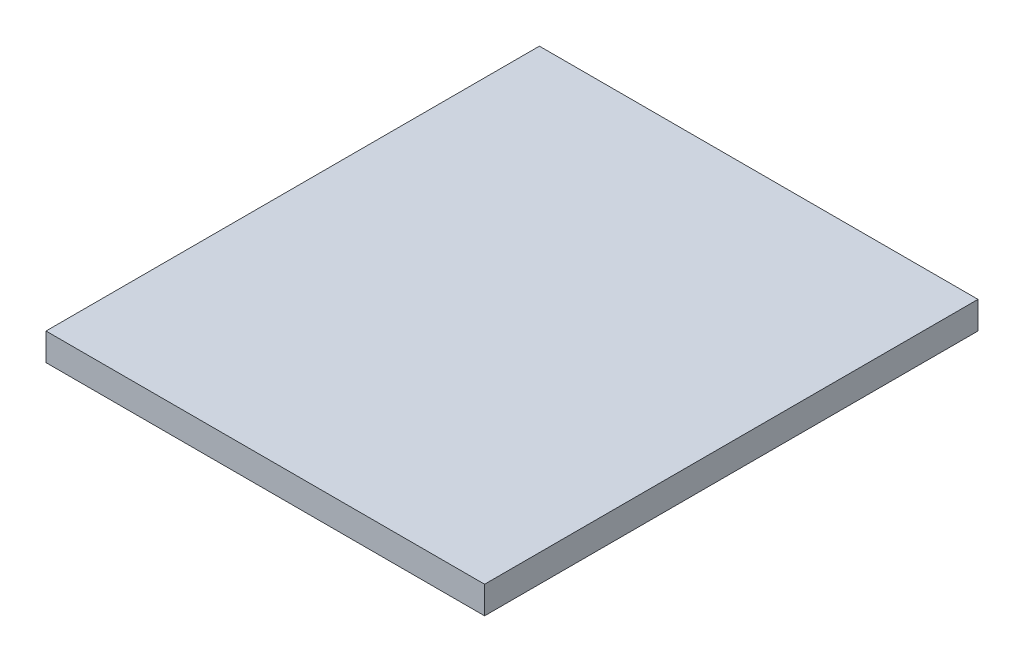
ISO-10303-21;
HEADER;
FILE_DESCRIPTION(('STEP AP214'),'2;1');
FILE_NAME('part.step','',(''),(''),'','','');
FILE_SCHEMA(('AUTOMOTIVE_DESIGN { 1 0 10303 214 1 1 1 1 }'));
ENDSEC;
DATA;
#1=APPLICATION_CONTEXT('core data for automotive mechanical design processes');
#2=APPLICATION_PROTOCOL_DEFINITION('international standard','automotive_design',2000,#1);
#3=PRODUCT_CONTEXT('',#1,'mechanical');
#4=PRODUCT('Part','Part','',(#3));
#5=PRODUCT_RELATED_PRODUCT_CATEGORY('part','',(#4));
#6=PRODUCT_DEFINITION_FORMATION('','',#4);
#7=PRODUCT_DEFINITION_CONTEXT('part definition',#1,'design');
#8=PRODUCT_DEFINITION('design','',#6,#7);
#9=PRODUCT_DEFINITION_SHAPE('','',#8);
#10=(LENGTH_UNIT() NAMED_UNIT(*) SI_UNIT(.MILLI.,.METRE.));
#11=(NAMED_UNIT(*) PLANE_ANGLE_UNIT() SI_UNIT($,.RADIAN.));
#12=(NAMED_UNIT(*) SI_UNIT($,.STERADIAN.) SOLID_ANGLE_UNIT());
#13=UNCERTAINTY_MEASURE_WITH_UNIT(LENGTH_MEASURE(1.E-05),#10,'distance_accuracy_value','');
#14=(GEOMETRIC_REPRESENTATION_CONTEXT(3) GLOBAL_UNCERTAINTY_ASSIGNED_CONTEXT((#13)) GLOBAL_UNIT_ASSIGNED_CONTEXT((#10,
#11,#12)) REPRESENTATION_CONTEXT('',''));
#15=CARTESIAN_POINT('',(0.,0.,0.));
#16=DIRECTION('',(0.,0.,1.));
#17=DIRECTION('',(1.,0.,0.));
#18=AXIS2_PLACEMENT_3D('',#15,#16,#17);
#19=CARTESIAN_POINT('',(-4.,0.5,4.5));
#20=DIRECTION('',(1.,0.,0.));
#21=DIRECTION('',(0.,0.,-1.));
#22=AXIS2_PLACEMENT_3D('',#19,#20,#21);
#23=PLANE('',#22);
#24=DIRECTION('',(0.,0.,1.));
#25=VECTOR('',#24,1.);
#26=CARTESIAN_POINT('',(-4.,0.,4.5));
#27=LINE('',#26,#25);
#28=CARTESIAN_POINT('',(-4.,0.,-4.5));
#29=VERTEX_POINT('',#28);
#30=CARTESIAN_POINT('',(-4.,0.,4.5));
#31=VERTEX_POINT('',#30);
#32=EDGE_CURVE('E96',#29,#31,#27,.T.);
#33=ORIENTED_EDGE('',*,*,#32,.T.);
#34=DIRECTION('',(0.,-1.,0.));
#35=VECTOR('',#34,1.);
#36=CARTESIAN_POINT('',(-4.,0.5,4.5));
#37=LINE('',#36,#35);
#38=CARTESIAN_POINT('',(-4.,0.5,4.5));
#39=VERTEX_POINT('',#38);
#40=EDGE_CURVE('E11',#39,#31,#37,.T.);
#41=ORIENTED_EDGE('',*,*,#40,.F.);
#42=DIRECTION('',(0.,0.,1.));
#43=VECTOR('',#42,1.);
#44=CARTESIAN_POINT('',(-4.,0.5,4.5));
#45=LINE('',#44,#43);
#46=CARTESIAN_POINT('',(-4.,0.5,-4.5));
#47=VERTEX_POINT('',#46);
#48=EDGE_CURVE('E84',#47,#39,#45,.T.);
#49=ORIENTED_EDGE('',*,*,#48,.F.);
#50=DIRECTION('',(0.,-1.,0.));
#51=VECTOR('',#50,1.);
#52=CARTESIAN_POINT('',(-4.,0.5,-4.5));
#53=LINE('',#52,#51);
#54=EDGE_CURVE('E92',#47,#29,#53,.T.);
#55=ORIENTED_EDGE('',*,*,#54,.T.);
#56=EDGE_LOOP('',(#33,#41,#49,#55));
#57=FACE_BOUND('',#56,.T.);
#58=ADVANCED_FACE('F33',(#57),#23,.F.);
#59=CARTESIAN_POINT('',(4.,0.5,4.5));
#60=DIRECTION('',(0.,0.,-1.));
#61=DIRECTION('',(-1.,0.,0.));
#62=AXIS2_PLACEMENT_3D('',#59,#60,#61);
#63=PLANE('',#62);
#64=DIRECTION('',(1.,0.,0.));
#65=VECTOR('',#64,1.);
#66=CARTESIAN_POINT('',(4.,0.,4.5));
#67=LINE('',#66,#65);
#68=CARTESIAN_POINT('',(4.,0.,4.5));
#69=VERTEX_POINT('',#68);
#70=EDGE_CURVE('E88',#31,#69,#67,.T.);
#71=ORIENTED_EDGE('',*,*,#70,.T.);
#72=DIRECTION('',(0.,-1.,0.));
#73=VECTOR('',#72,1.);
#74=CARTESIAN_POINT('',(4.,0.5,4.5));
#75=LINE('',#74,#73);
#76=CARTESIAN_POINT('',(4.,0.5,4.5));
#77=VERTEX_POINT('',#76);
#78=EDGE_CURVE('E41',#77,#69,#75,.T.);
#79=ORIENTED_EDGE('',*,*,#78,.F.);
#80=DIRECTION('',(1.,0.,0.));
#81=VECTOR('',#80,1.);
#82=CARTESIAN_POINT('',(4.,0.5,4.5));
#83=LINE('',#82,#81);
#84=EDGE_CURVE('E79',#39,#77,#83,.T.);
#85=ORIENTED_EDGE('',*,*,#84,.F.);
#86=ORIENTED_EDGE('',*,*,#40,.T.);
#87=EDGE_LOOP('',(#71,#79,#85,#86));
#88=FACE_BOUND('',#87,.T.);
#89=ADVANCED_FACE('F87',(#88),#63,.F.);
#90=CARTESIAN_POINT('',(4.,0.5,4.5));
#91=DIRECTION('',(-1.,0.,0.));
#92=DIRECTION('',(0.,0.,1.));
#93=AXIS2_PLACEMENT_3D('',#90,#91,#92);
#94=PLANE('',#93);
#95=DIRECTION('',(0.,0.,-1.));
#96=VECTOR('',#95,1.);
#97=CARTESIAN_POINT('',(4.,0.,4.5));
#98=LINE('',#97,#96);
#99=CARTESIAN_POINT('',(4.,0.,-4.5));
#100=VERTEX_POINT('',#99);
#101=EDGE_CURVE('E66',#69,#100,#98,.T.);
#102=ORIENTED_EDGE('',*,*,#101,.T.);
#103=DIRECTION('',(0.,-1.,0.));
#104=VECTOR('',#103,1.);
#105=CARTESIAN_POINT('',(4.,0.5,-4.5));
#106=LINE('',#105,#104);
#107=CARTESIAN_POINT('',(4.,0.5,-4.5));
#108=VERTEX_POINT('',#107);
#109=EDGE_CURVE('E89',#108,#100,#106,.T.);
#110=ORIENTED_EDGE('',*,*,#109,.F.);
#111=DIRECTION('',(0.,0.,-1.));
#112=VECTOR('',#111,1.);
#113=CARTESIAN_POINT('',(4.,0.5,4.5));
#114=LINE('',#113,#112);
#115=EDGE_CURVE('E82',#77,#108,#114,.T.);
#116=ORIENTED_EDGE('',*,*,#115,.F.);
#117=ORIENTED_EDGE('',*,*,#78,.T.);
#118=EDGE_LOOP('',(#102,#110,#116,#117));
#119=FACE_BOUND('',#118,.T.);
#120=ADVANCED_FACE('F90',(#119),#94,.F.);
#121=CARTESIAN_POINT('',(4.,0.5,-4.5));
#122=DIRECTION('',(0.,0.,1.));
#123=DIRECTION('',(1.,0.,0.));
#124=AXIS2_PLACEMENT_3D('',#121,#122,#123);
#125=PLANE('',#124);
#126=DIRECTION('',(-1.,0.,0.));
#127=VECTOR('',#126,1.);
#128=CARTESIAN_POINT('',(4.,0.,-4.5));
#129=LINE('',#128,#127);
#130=EDGE_CURVE('E72',#100,#29,#129,.T.);
#131=ORIENTED_EDGE('',*,*,#130,.T.);
#132=ORIENTED_EDGE('',*,*,#54,.F.);
#133=DIRECTION('',(-1.,0.,0.));
#134=VECTOR('',#133,1.);
#135=CARTESIAN_POINT('',(4.,0.5,-4.5));
#136=LINE('',#135,#134);
#137=EDGE_CURVE('E49',#108,#47,#136,.T.);
#138=ORIENTED_EDGE('',*,*,#137,.F.);
#139=ORIENTED_EDGE('',*,*,#109,.T.);
#140=EDGE_LOOP('',(#131,#132,#138,#139));
#141=FACE_BOUND('',#140,.T.);
#142=ADVANCED_FACE('F103',(#141),#125,.F.);
#143=CARTESIAN_POINT('',(0.,0.5,0.));
#144=DIRECTION('',(0.,1.,0.));
#145=DIRECTION('',(0.,0.,1.));
#146=AXIS2_PLACEMENT_3D('',#143,#144,#145);
#147=PLANE('',#146);
#148=ORIENTED_EDGE('',*,*,#48,.T.);
#149=ORIENTED_EDGE('',*,*,#84,.T.);
#150=ORIENTED_EDGE('',*,*,#115,.T.);
#151=ORIENTED_EDGE('',*,*,#137,.T.);
#152=EDGE_LOOP('',(#148,#149,#150,#151));
#153=FACE_BOUND('',#152,.T.);
#154=ADVANCED_FACE('F80',(#153),#147,.T.);
#155=CARTESIAN_POINT('',(0.,0.,0.));
#156=DIRECTION('',(0.,1.,0.));
#157=DIRECTION('',(0.,0.,1.));
#158=AXIS2_PLACEMENT_3D('',#155,#156,#157);
#159=PLANE('',#158);
#160=ORIENTED_EDGE('',*,*,#32,.F.);
#161=ORIENTED_EDGE('',*,*,#130,.F.);
#162=ORIENTED_EDGE('',*,*,#101,.F.);
#163=ORIENTED_EDGE('',*,*,#70,.F.);
#164=EDGE_LOOP('',(#160,#161,#162,#163));
#165=FACE_BOUND('',#164,.T.);
#166=ADVANCED_FACE('F106',(#165),#159,.F.);
#167=CLOSED_SHELL('',(#58,#89,#120,#142,#154,#166));
#168=MANIFOLD_SOLID_BREP('B2',#167);
#169=ADVANCED_BREP_SHAPE_REPRESENTATION('',(#18,#168),#14);
#170=SHAPE_DEFINITION_REPRESENTATION(#9,#169);
ENDSEC;
END-ISO-10303-21;
